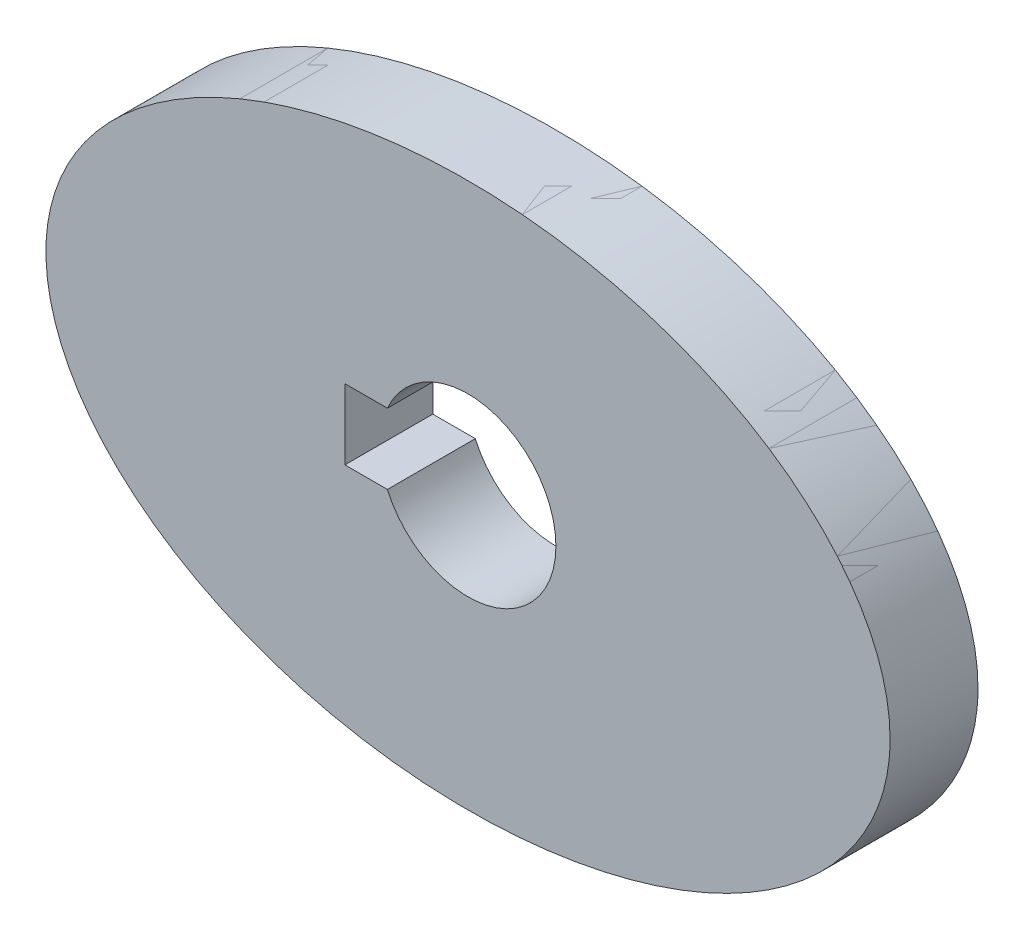
ISO-10303-21;
HEADER;
FILE_DESCRIPTION(('STEP AP214'),'2;1');
FILE_NAME('part.step','',(''),(''),'','','');
FILE_SCHEMA(('AUTOMOTIVE_DESIGN { 1 0 10303 214 1 1 1 1 }'));
ENDSEC;
DATA;
#1=APPLICATION_CONTEXT('core data for automotive mechanical design processes');
#2=APPLICATION_PROTOCOL_DEFINITION('international standard','automotive_design',2000,#1);
#3=PRODUCT_CONTEXT('',#1,'mechanical');
#4=PRODUCT('Part','Part','',(#3));
#5=PRODUCT_RELATED_PRODUCT_CATEGORY('part','',(#4));
#6=PRODUCT_DEFINITION_FORMATION('','',#4);
#7=PRODUCT_DEFINITION_CONTEXT('part definition',#1,'design');
#8=PRODUCT_DEFINITION('design','',#6,#7);
#9=PRODUCT_DEFINITION_SHAPE('','',#8);
#10=(LENGTH_UNIT() NAMED_UNIT(*) SI_UNIT(.MILLI.,.METRE.));
#11=(NAMED_UNIT(*) PLANE_ANGLE_UNIT() SI_UNIT($,.RADIAN.));
#12=(NAMED_UNIT(*) SI_UNIT($,.STERADIAN.) SOLID_ANGLE_UNIT());
#13=UNCERTAINTY_MEASURE_WITH_UNIT(LENGTH_MEASURE(1.E-05),#10,'distance_accuracy_value','');
#14=(GEOMETRIC_REPRESENTATION_CONTEXT(3) GLOBAL_UNCERTAINTY_ASSIGNED_CONTEXT((#13)) GLOBAL_UNIT_ASSIGNED_CONTEXT((#10,
#11,#12)) REPRESENTATION_CONTEXT('',''));
#15=CARTESIAN_POINT('',(0.,0.,0.));
#16=DIRECTION('',(0.,0.,1.));
#17=DIRECTION('',(1.,0.,0.));
#18=AXIS2_PLACEMENT_3D('',#15,#16,#17);
#19=CARTESIAN_POINT('',(0.,0.,5.));
#20=DIRECTION('',(0.,0.,1.));
#21=DIRECTION('',(1.,0.,0.));
#22=AXIS2_PLACEMENT_3D('',#19,#20,#21);
#23=ELLIPSE('',#22,24.,15.5);
#24=DIRECTION('',(0.,0.,-1.));
#25=VECTOR('',#24,1.);
#26=SURFACE_OF_LINEAR_EXTRUSION('',#23,#25);
#27=CARTESIAN_POINT('',(24.,0.,5.));
#28=VERTEX_POINT('',#27);
#29=EDGE_CURVE('E47',#28,#28,#23,.T.);
#30=ORIENTED_EDGE('',*,*,#29,.T.);
#31=EDGE_LOOP('',(#30));
#32=FACE_BOUND('',#31,.T.);
#33=CARTESIAN_POINT('',(0.,0.,0.));
#34=DIRECTION('',(0.,0.,1.));
#35=DIRECTION('',(1.,0.,0.));
#36=AXIS2_PLACEMENT_3D('',#33,#34,#35);
#37=ELLIPSE('',#36,24.,15.5);
#38=CARTESIAN_POINT('',(24.,0.,0.));
#39=VERTEX_POINT('',#38);
#40=EDGE_CURVE('E11',#39,#39,#37,.T.);
#41=ORIENTED_EDGE('',*,*,#40,.F.);
#42=EDGE_LOOP('',(#41));
#43=FACE_BOUND('',#42,.T.);
#44=ADVANCED_FACE('F43',(#32,#43),#26,.T.);
#45=OPEN_SHELL('',(#44));
#46=SHELL_BASED_SURFACE_MODEL('B2',(#45));
#47=CARTESIAN_POINT('',(0.,0.,5.));
#48=DIRECTION('',(0.,0.,1.));
#49=DIRECTION('',(1.,0.,0.));
#50=AXIS2_PLACEMENT_3D('',#47,#48,#49);
#51=PLANE('',#50);
#52=CARTESIAN_POINT('',(0.,0.,5.));
#53=DIRECTION('',(0.,0.,1.));
#54=DIRECTION('',(1.,0.,0.));
#55=AXIS2_PLACEMENT_3D('',#52,#53,#54);
#56=ELLIPSE('',#55,24.,15.5);
#57=CARTESIAN_POINT('',(24.,0.,5.));
#58=VERTEX_POINT('',#57);
#59=EDGE_CURVE('E41',#58,#58,#56,.T.);
#60=ORIENTED_EDGE('',*,*,#59,.T.);
#61=EDGE_LOOP('',(#60));
#62=FACE_BOUND('',#61,.T.);
#63=DIRECTION('',(-1.,0.,0.));
#64=VECTOR('',#63,1.);
#65=CARTESIAN_POINT('',(-7.,2.,5.));
#66=LINE('',#65,#64);
#67=CARTESIAN_POINT('',(-4.58257569495584,2.,5.));
#68=VERTEX_POINT('',#67);
#69=CARTESIAN_POINT('',(-7.,2.,5.));
#70=VERTEX_POINT('',#69);
#71=EDGE_CURVE('E118',#68,#70,#66,.T.);
#72=ORIENTED_EDGE('',*,*,#71,.F.);
#73=CARTESIAN_POINT('',(0.,0.,5.));
#74=DIRECTION('',(0.,0.,1.));
#75=DIRECTION('',(1.,0.,0.));
#76=AXIS2_PLACEMENT_3D('',#73,#74,#75);
#77=CIRCLE('',#76,5.);
#78=CARTESIAN_POINT('',(-4.58257569495584,-2.,5.));
#79=VERTEX_POINT('',#78);
#80=EDGE_CURVE('E110',#79,#68,#77,.T.);
#81=ORIENTED_EDGE('',*,*,#80,.F.);
#82=DIRECTION('',(1.,0.,0.));
#83=VECTOR('',#82,1.);
#84=CARTESIAN_POINT('',(-7.,-2.,5.));
#85=LINE('',#84,#83);
#86=CARTESIAN_POINT('',(-7.,-2.,5.));
#87=VERTEX_POINT('',#86);
#88=EDGE_CURVE('E131',#87,#79,#85,.T.);
#89=ORIENTED_EDGE('',*,*,#88,.F.);
#90=DIRECTION('',(0.,-1.,0.));
#91=VECTOR('',#90,1.);
#92=CARTESIAN_POINT('',(-7.,2.,5.));
#93=LINE('',#92,#91);
#94=EDGE_CURVE('E129',#70,#87,#93,.T.);
#95=ORIENTED_EDGE('',*,*,#94,.F.);
#96=EDGE_LOOP('',(#72,#81,#89,#95));
#97=FACE_BOUND('',#96,.T.);
#98=ADVANCED_FACE('F69',(#62,#97),#51,.T.);
#99=CARTESIAN_POINT('',(0.,0.,0.));
#100=DIRECTION('',(0.,0.,1.));
#101=DIRECTION('',(1.,0.,0.));
#102=AXIS2_PLACEMENT_3D('',#99,#100,#101);
#103=PLANE('',#102);
#104=CARTESIAN_POINT('',(0.,0.,0.));
#105=DIRECTION('',(0.,0.,1.));
#106=DIRECTION('',(1.,0.,0.));
#107=AXIS2_PLACEMENT_3D('',#104,#105,#106);
#108=ELLIPSE('',#107,24.,15.5);
#109=CARTESIAN_POINT('',(24.,0.,0.));
#110=VERTEX_POINT('',#109);
#111=EDGE_CURVE('E74',#110,#110,#108,.T.);
#112=ORIENTED_EDGE('',*,*,#111,.F.);
#113=EDGE_LOOP('',(#112));
#114=FACE_BOUND('',#113,.T.);
#115=CARTESIAN_POINT('',(0.,0.,0.));
#116=DIRECTION('',(0.,0.,1.));
#117=DIRECTION('',(1.,0.,0.));
#118=AXIS2_PLACEMENT_3D('',#115,#116,#117);
#119=CIRCLE('',#118,5.);
#120=CARTESIAN_POINT('',(-4.58257569495584,-2.,0.));
#121=VERTEX_POINT('',#120);
#122=CARTESIAN_POINT('',(-4.58257569495584,2.,0.));
#123=VERTEX_POINT('',#122);
#124=EDGE_CURVE('E92',#121,#123,#119,.T.);
#125=ORIENTED_EDGE('',*,*,#124,.T.);
#126=DIRECTION('',(-1.,0.,0.));
#127=VECTOR('',#126,1.);
#128=CARTESIAN_POINT('',(-7.,2.,0.));
#129=LINE('',#128,#127);
#130=CARTESIAN_POINT('',(-7.,2.,0.));
#131=VERTEX_POINT('',#130);
#132=EDGE_CURVE('E125',#123,#131,#129,.T.);
#133=ORIENTED_EDGE('',*,*,#132,.T.);
#134=DIRECTION('',(0.,-1.,0.));
#135=VECTOR('',#134,1.);
#136=CARTESIAN_POINT('',(-7.,2.,0.));
#137=LINE('',#136,#135);
#138=CARTESIAN_POINT('',(-7.,-2.,0.));
#139=VERTEX_POINT('',#138);
#140=EDGE_CURVE('E137',#131,#139,#137,.T.);
#141=ORIENTED_EDGE('',*,*,#140,.T.);
#142=DIRECTION('',(1.,0.,0.));
#143=VECTOR('',#142,1.);
#144=CARTESIAN_POINT('',(-7.,-2.,0.));
#145=LINE('',#144,#143);
#146=EDGE_CURVE('E119',#139,#121,#145,.T.);
#147=ORIENTED_EDGE('',*,*,#146,.T.);
#148=EDGE_LOOP('',(#125,#133,#141,#147));
#149=FACE_BOUND('',#148,.T.);
#150=ADVANCED_FACE('F149',(#114,#149),#103,.F.);
#151=DIRECTION('',(0.,0.,-1.));
#152=VECTOR('',#151,1.);
#153=SURFACE_OF_LINEAR_EXTRUSION('',#56,#152);
#154=ORIENTED_EDGE('',*,*,#59,.F.);
#155=EDGE_LOOP('',(#154));
#156=FACE_BOUND('',#155,.T.);
#157=ORIENTED_EDGE('',*,*,#111,.T.);
#158=EDGE_LOOP('',(#157));
#159=FACE_BOUND('',#158,.T.);
#160=ADVANCED_FACE('F71',(#156,#159),#153,.F.);
#161=CARTESIAN_POINT('',(0.,0.,5.));
#162=DIRECTION('',(0.,0.,-1.));
#163=DIRECTION('',(-1.,0.,0.));
#164=AXIS2_PLACEMENT_3D('',#161,#162,#163);
#165=CYLINDRICAL_SURFACE('',#164,5.);
#166=ORIENTED_EDGE('',*,*,#124,.F.);
#167=DIRECTION('',(0.,0.,-1.));
#168=VECTOR('',#167,1.);
#169=CARTESIAN_POINT('',(-4.58257569495584,-2.,5.));
#170=LINE('',#169,#168);
#171=EDGE_CURVE('E114',#79,#121,#170,.T.);
#172=ORIENTED_EDGE('',*,*,#171,.F.);
#173=ORIENTED_EDGE('',*,*,#80,.T.);
#174=DIRECTION('',(0.,0.,-1.));
#175=VECTOR('',#174,1.);
#176=CARTESIAN_POINT('',(-4.58257569495584,2.,5.));
#177=LINE('',#176,#175);
#178=EDGE_CURVE('E113',#68,#123,#177,.T.);
#179=ORIENTED_EDGE('',*,*,#178,.T.);
#180=EDGE_LOOP('',(#166,#172,#173,#179));
#181=FACE_BOUND('',#180,.T.);
#182=ADVANCED_FACE('F112',(#181),#165,.F.);
#183=CARTESIAN_POINT('',(-7.,2.,5.));
#184=DIRECTION('',(0.,-1.,0.));
#185=DIRECTION('',(0.,0.,-1.));
#186=AXIS2_PLACEMENT_3D('',#183,#184,#185);
#187=PLANE('',#186);
#188=ORIENTED_EDGE('',*,*,#132,.F.);
#189=ORIENTED_EDGE('',*,*,#178,.F.);
#190=ORIENTED_EDGE('',*,*,#71,.T.);
#191=DIRECTION('',(0.,0.,-1.));
#192=VECTOR('',#191,1.);
#193=CARTESIAN_POINT('',(-7.,2.,5.));
#194=LINE('',#193,#192);
#195=EDGE_CURVE('E126',#70,#131,#194,.T.);
#196=ORIENTED_EDGE('',*,*,#195,.T.);
#197=EDGE_LOOP('',(#188,#189,#190,#196));
#198=FACE_BOUND('',#197,.T.);
#199=ADVANCED_FACE('F122',(#198),#187,.T.);
#200=CARTESIAN_POINT('',(-7.,2.,5.));
#201=DIRECTION('',(1.,0.,0.));
#202=DIRECTION('',(0.,0.,-1.));
#203=AXIS2_PLACEMENT_3D('',#200,#201,#202);
#204=PLANE('',#203);
#205=ORIENTED_EDGE('',*,*,#140,.F.);
#206=ORIENTED_EDGE('',*,*,#195,.F.);
#207=ORIENTED_EDGE('',*,*,#94,.T.);
#208=DIRECTION('',(0.,0.,-1.));
#209=VECTOR('',#208,1.);
#210=CARTESIAN_POINT('',(-7.,-2.,5.));
#211=LINE('',#210,#209);
#212=EDGE_CURVE('E84',#87,#139,#211,.T.);
#213=ORIENTED_EDGE('',*,*,#212,.T.);
#214=EDGE_LOOP('',(#205,#206,#207,#213));
#215=FACE_BOUND('',#214,.T.);
#216=ADVANCED_FACE('F147',(#215),#204,.T.);
#217=CARTESIAN_POINT('',(-7.,-2.,5.));
#218=DIRECTION('',(0.,1.,0.));
#219=DIRECTION('',(0.,0.,1.));
#220=AXIS2_PLACEMENT_3D('',#217,#218,#219);
#221=PLANE('',#220);
#222=ORIENTED_EDGE('',*,*,#146,.F.);
#223=ORIENTED_EDGE('',*,*,#212,.F.);
#224=ORIENTED_EDGE('',*,*,#88,.T.);
#225=ORIENTED_EDGE('',*,*,#171,.T.);
#226=EDGE_LOOP('',(#222,#223,#224,#225));
#227=FACE_BOUND('',#226,.T.);
#228=ADVANCED_FACE('F150',(#227),#221,.T.);
#229=CLOSED_SHELL('',(#98,#150,#160,#182,#199,#216,#228));
#230=MANIFOLD_SOLID_BREP('B6',#229);
#231=ADVANCED_BREP_SHAPE_REPRESENTATION('',(#18,#230),#14);
#232=MANIFOLD_SURFACE_SHAPE_REPRESENTATION('',(#18,#46),#14);
#233=SHAPE_REPRESENTATION('',(#18),#14);
#234=SHAPE_DEFINITION_REPRESENTATION(#9,#233);
#235=SHAPE_REPRESENTATION_RELATIONSHIP('','',#233,#231);
#236=SHAPE_REPRESENTATION_RELATIONSHIP('','',#233,#232);
ENDSEC;
END-ISO-10303-21;
